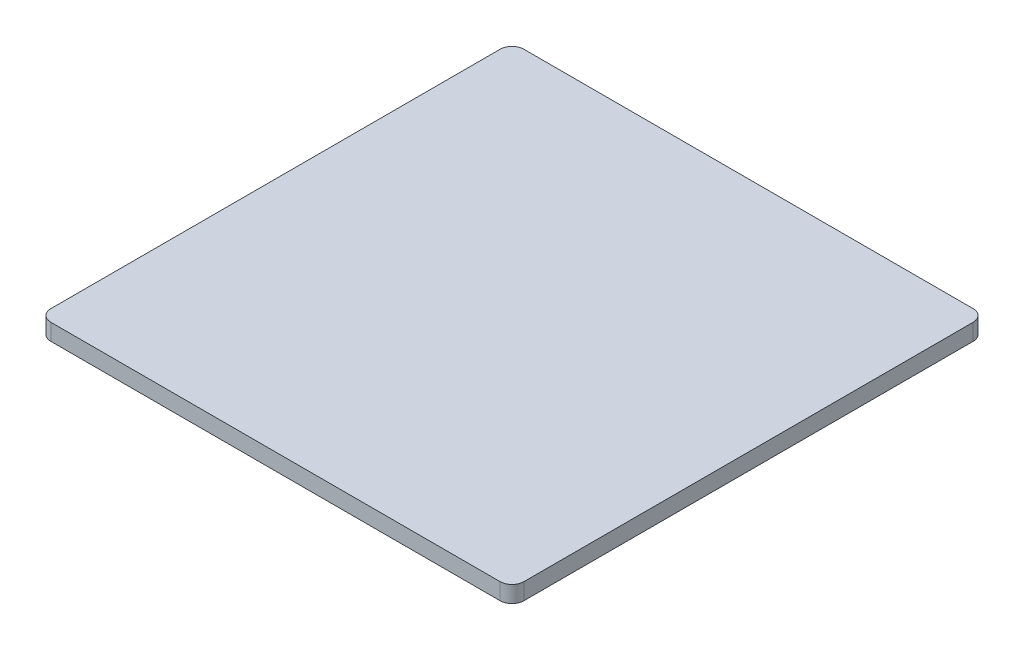
ISO-10303-21;
HEADER;
FILE_DESCRIPTION(('STEP AP214'),'2;1');
FILE_NAME('part.step','',(''),(''),'','','');
FILE_SCHEMA(('AUTOMOTIVE_DESIGN { 1 0 10303 214 1 1 1 1 }'));
ENDSEC;
DATA;
#1=APPLICATION_CONTEXT('core data for automotive mechanical design processes');
#2=APPLICATION_PROTOCOL_DEFINITION('international standard','automotive_design',2000,#1);
#3=PRODUCT_CONTEXT('',#1,'mechanical');
#4=PRODUCT('Part','Part','',(#3));
#5=PRODUCT_RELATED_PRODUCT_CATEGORY('part','',(#4));
#6=PRODUCT_DEFINITION_FORMATION('','',#4);
#7=PRODUCT_DEFINITION_CONTEXT('part definition',#1,'design');
#8=PRODUCT_DEFINITION('design','',#6,#7);
#9=PRODUCT_DEFINITION_SHAPE('','',#8);
#10=(LENGTH_UNIT() NAMED_UNIT(*) SI_UNIT(.MILLI.,.METRE.));
#11=(NAMED_UNIT(*) PLANE_ANGLE_UNIT() SI_UNIT($,.RADIAN.));
#12=(NAMED_UNIT(*) SI_UNIT($,.STERADIAN.) SOLID_ANGLE_UNIT());
#13=UNCERTAINTY_MEASURE_WITH_UNIT(LENGTH_MEASURE(1.E-05),#10,'distance_accuracy_value','');
#14=(GEOMETRIC_REPRESENTATION_CONTEXT(3) GLOBAL_UNCERTAINTY_ASSIGNED_CONTEXT((#13)) GLOBAL_UNIT_ASSIGNED_CONTEXT((#10,
#11,#12)) REPRESENTATION_CONTEXT('',''));
#15=CARTESIAN_POINT('',(0.,0.,0.));
#16=DIRECTION('',(0.,0.,1.));
#17=DIRECTION('',(1.,0.,0.));
#18=AXIS2_PLACEMENT_3D('',#15,#16,#17);
#19=CARTESIAN_POINT('',(9.5,0.7,-9.5));
#20=DIRECTION('',(0.,-1.,0.));
#21=DIRECTION('',(0.,0.,-1.));
#22=AXIS2_PLACEMENT_3D('',#19,#20,#21);
#23=CYLINDRICAL_SURFACE('',#22,0.5);
#24=CARTESIAN_POINT('',(9.5,0.,-9.5));
#25=DIRECTION('',(0.,1.,0.));
#26=DIRECTION('',(0.,0.,1.));
#27=AXIS2_PLACEMENT_3D('',#24,#25,#26);
#28=CIRCLE('',#27,0.5);
#29=CARTESIAN_POINT('',(10.,0.,-9.5));
#30=VERTEX_POINT('',#29);
#31=CARTESIAN_POINT('',(9.5,0.,-10.));
#32=VERTEX_POINT('',#31);
#33=EDGE_CURVE('E131',#30,#32,#28,.T.);
#34=ORIENTED_EDGE('',*,*,#33,.T.);
#35=DIRECTION('',(0.,-1.,0.));
#36=VECTOR('',#35,1.);
#37=CARTESIAN_POINT('',(9.5,0.7,-10.));
#38=LINE('',#37,#36);
#39=CARTESIAN_POINT('',(9.5,0.7,-10.));
#40=VERTEX_POINT('',#39);
#41=EDGE_CURVE('E11',#40,#32,#38,.T.);
#42=ORIENTED_EDGE('',*,*,#41,.F.);
#43=CARTESIAN_POINT('',(9.5,0.7,-9.5));
#44=DIRECTION('',(0.,1.,0.));
#45=DIRECTION('',(0.,0.,1.));
#46=AXIS2_PLACEMENT_3D('',#43,#44,#45);
#47=CIRCLE('',#46,0.5);
#48=CARTESIAN_POINT('',(10.,0.7,-9.5));
#49=VERTEX_POINT('',#48);
#50=EDGE_CURVE('E145',#49,#40,#47,.T.);
#51=ORIENTED_EDGE('',*,*,#50,.F.);
#52=DIRECTION('',(0.,-1.,0.));
#53=VECTOR('',#52,1.);
#54=CARTESIAN_POINT('',(10.,0.7,-9.5));
#55=LINE('',#54,#53);
#56=EDGE_CURVE('E127',#49,#30,#55,.T.);
#57=ORIENTED_EDGE('',*,*,#56,.T.);
#58=EDGE_LOOP('',(#34,#42,#51,#57));
#59=FACE_BOUND('',#58,.T.);
#60=ADVANCED_FACE('F35',(#59),#23,.T.);
#61=CARTESIAN_POINT('',(9.5,0.7,-10.));
#62=DIRECTION('',(0.,0.,1.));
#63=DIRECTION('',(1.,0.,0.));
#64=AXIS2_PLACEMENT_3D('',#61,#62,#63);
#65=PLANE('',#64);
#66=DIRECTION('',(-1.,0.,0.));
#67=VECTOR('',#66,1.);
#68=CARTESIAN_POINT('',(9.5,0.,-10.));
#69=LINE('',#68,#67);
#70=CARTESIAN_POINT('',(-9.5,0.,-10.));
#71=VERTEX_POINT('',#70);
#72=EDGE_CURVE('E134',#32,#71,#69,.T.);
#73=ORIENTED_EDGE('',*,*,#72,.T.);
#74=DIRECTION('',(0.,-1.,0.));
#75=VECTOR('',#74,1.);
#76=CARTESIAN_POINT('',(-9.5,0.7,-10.));
#77=LINE('',#76,#75);
#78=CARTESIAN_POINT('',(-9.5,0.7,-10.));
#79=VERTEX_POINT('',#78);
#80=EDGE_CURVE('E43',#79,#71,#77,.T.);
#81=ORIENTED_EDGE('',*,*,#80,.F.);
#82=DIRECTION('',(-1.,0.,0.));
#83=VECTOR('',#82,1.);
#84=CARTESIAN_POINT('',(9.5,0.7,-10.));
#85=LINE('',#84,#83);
#86=EDGE_CURVE('E94',#40,#79,#85,.T.);
#87=ORIENTED_EDGE('',*,*,#86,.F.);
#88=ORIENTED_EDGE('',*,*,#41,.T.);
#89=EDGE_LOOP('',(#73,#81,#87,#88));
#90=FACE_BOUND('',#89,.T.);
#91=ADVANCED_FACE('F180',(#90),#65,.F.);
#92=CARTESIAN_POINT('',(-9.5,0.7,-9.5));
#93=DIRECTION('',(0.,-1.,0.));
#94=DIRECTION('',(0.,0.,-1.));
#95=AXIS2_PLACEMENT_3D('',#92,#93,#94);
#96=CYLINDRICAL_SURFACE('',#95,0.5);
#97=CARTESIAN_POINT('',(-9.5,0.,-9.5));
#98=DIRECTION('',(0.,1.,0.));
#99=DIRECTION('',(0.,0.,1.));
#100=AXIS2_PLACEMENT_3D('',#97,#98,#99);
#101=CIRCLE('',#100,0.5);
#102=CARTESIAN_POINT('',(-10.,0.,-9.5));
#103=VERTEX_POINT('',#102);
#104=EDGE_CURVE('E136',#71,#103,#101,.T.);
#105=ORIENTED_EDGE('',*,*,#104,.T.);
#106=DIRECTION('',(0.,-1.,0.));
#107=VECTOR('',#106,1.);
#108=CARTESIAN_POINT('',(-10.,0.7,-9.5));
#109=LINE('',#108,#107);
#110=CARTESIAN_POINT('',(-10.,0.7,-9.5));
#111=VERTEX_POINT('',#110);
#112=EDGE_CURVE('E152',#111,#103,#109,.T.);
#113=ORIENTED_EDGE('',*,*,#112,.F.);
#114=CARTESIAN_POINT('',(-9.5,0.7,-9.5));
#115=DIRECTION('',(0.,1.,0.));
#116=DIRECTION('',(0.,0.,1.));
#117=AXIS2_PLACEMENT_3D('',#114,#115,#116);
#118=CIRCLE('',#117,0.5);
#119=EDGE_CURVE('E160',#79,#111,#118,.T.);
#120=ORIENTED_EDGE('',*,*,#119,.F.);
#121=ORIENTED_EDGE('',*,*,#80,.T.);
#122=EDGE_LOOP('',(#105,#113,#120,#121));
#123=FACE_BOUND('',#122,.T.);
#124=ADVANCED_FACE('F158',(#123),#96,.T.);
#125=CARTESIAN_POINT('',(-10.,0.7,9.5));
#126=DIRECTION('',(1.,0.,0.));
#127=DIRECTION('',(0.,0.,-1.));
#128=AXIS2_PLACEMENT_3D('',#125,#126,#127);
#129=PLANE('',#128);
#130=DIRECTION('',(0.,0.,1.));
#131=VECTOR('',#130,1.);
#132=CARTESIAN_POINT('',(-10.,0.,9.5));
#133=LINE('',#132,#131);
#134=CARTESIAN_POINT('',(-10.,0.,9.5));
#135=VERTEX_POINT('',#134);
#136=EDGE_CURVE('E138',#103,#135,#133,.T.);
#137=ORIENTED_EDGE('',*,*,#136,.T.);
#138=DIRECTION('',(0.,-1.,0.));
#139=VECTOR('',#138,1.);
#140=CARTESIAN_POINT('',(-10.,0.7,9.5));
#141=LINE('',#140,#139);
#142=CARTESIAN_POINT('',(-10.,0.7,9.5));
#143=VERTEX_POINT('',#142);
#144=EDGE_CURVE('E149',#143,#135,#141,.T.);
#145=ORIENTED_EDGE('',*,*,#144,.F.);
#146=DIRECTION('',(0.,0.,1.));
#147=VECTOR('',#146,1.);
#148=CARTESIAN_POINT('',(-10.,0.7,9.5));
#149=LINE('',#148,#147);
#150=EDGE_CURVE('E172',#111,#143,#149,.T.);
#151=ORIENTED_EDGE('',*,*,#150,.F.);
#152=ORIENTED_EDGE('',*,*,#112,.T.);
#153=EDGE_LOOP('',(#137,#145,#151,#152));
#154=FACE_BOUND('',#153,.T.);
#155=ADVANCED_FACE('F168',(#154),#129,.F.);
#156=CARTESIAN_POINT('',(-9.5,0.7,9.5));
#157=DIRECTION('',(0.,-1.,0.));
#158=DIRECTION('',(0.,0.,-1.));
#159=AXIS2_PLACEMENT_3D('',#156,#157,#158);
#160=CYLINDRICAL_SURFACE('',#159,0.5);
#161=CARTESIAN_POINT('',(-9.5,0.,9.5));
#162=DIRECTION('',(0.,1.,0.));
#163=DIRECTION('',(0.,0.,-1.));
#164=AXIS2_PLACEMENT_3D('',#161,#162,#163);
#165=CIRCLE('',#164,0.5);
#166=CARTESIAN_POINT('',(-9.5,0.,10.));
#167=VERTEX_POINT('',#166);
#168=EDGE_CURVE('E140',#135,#167,#165,.T.);
#169=ORIENTED_EDGE('',*,*,#168,.T.);
#170=DIRECTION('',(0.,-1.,0.));
#171=VECTOR('',#170,1.);
#172=CARTESIAN_POINT('',(-9.5,0.7,10.));
#173=LINE('',#172,#171);
#174=CARTESIAN_POINT('',(-9.5,0.7,10.));
#175=VERTEX_POINT('',#174);
#176=EDGE_CURVE('E122',#175,#167,#173,.T.);
#177=ORIENTED_EDGE('',*,*,#176,.F.);
#178=CARTESIAN_POINT('',(-9.5,0.7,9.5));
#179=DIRECTION('',(0.,1.,0.));
#180=DIRECTION('',(0.,0.,-1.));
#181=AXIS2_PLACEMENT_3D('',#178,#179,#180);
#182=CIRCLE('',#181,0.5);
#183=EDGE_CURVE('E113',#143,#175,#182,.T.);
#184=ORIENTED_EDGE('',*,*,#183,.F.);
#185=ORIENTED_EDGE('',*,*,#144,.T.);
#186=EDGE_LOOP('',(#169,#177,#184,#185));
#187=FACE_BOUND('',#186,.T.);
#188=ADVANCED_FACE('F171',(#187),#160,.T.);
#189=CARTESIAN_POINT('',(9.5,0.7,10.));
#190=DIRECTION('',(0.,0.,-1.));
#191=DIRECTION('',(-1.,0.,0.));
#192=AXIS2_PLACEMENT_3D('',#189,#190,#191);
#193=PLANE('',#192);
#194=DIRECTION('',(1.,0.,0.));
#195=VECTOR('',#194,1.);
#196=CARTESIAN_POINT('',(9.5,0.,10.));
#197=LINE('',#196,#195);
#198=CARTESIAN_POINT('',(9.5,0.,10.));
#199=VERTEX_POINT('',#198);
#200=EDGE_CURVE('E121',#167,#199,#197,.T.);
#201=ORIENTED_EDGE('',*,*,#200,.T.);
#202=DIRECTION('',(0.,-1.,0.));
#203=VECTOR('',#202,1.);
#204=CARTESIAN_POINT('',(9.5,0.7,10.));
#205=LINE('',#204,#203);
#206=CARTESIAN_POINT('',(9.5,0.7,10.));
#207=VERTEX_POINT('',#206);
#208=EDGE_CURVE('E118',#207,#199,#205,.T.);
#209=ORIENTED_EDGE('',*,*,#208,.F.);
#210=DIRECTION('',(1.,0.,0.));
#211=VECTOR('',#210,1.);
#212=CARTESIAN_POINT('',(9.5,0.7,10.));
#213=LINE('',#212,#211);
#214=EDGE_CURVE('E107',#175,#207,#213,.T.);
#215=ORIENTED_EDGE('',*,*,#214,.F.);
#216=ORIENTED_EDGE('',*,*,#176,.T.);
#217=EDGE_LOOP('',(#201,#209,#215,#216));
#218=FACE_BOUND('',#217,.T.);
#219=ADVANCED_FACE('F119',(#218),#193,.F.);
#220=CARTESIAN_POINT('',(9.5,0.7,9.5));
#221=DIRECTION('',(0.,-1.,0.));
#222=DIRECTION('',(0.,0.,-1.));
#223=AXIS2_PLACEMENT_3D('',#220,#221,#222);
#224=CYLINDRICAL_SURFACE('',#223,0.500000000000001);
#225=CARTESIAN_POINT('',(9.5,0.,9.5));
#226=DIRECTION('',(0.,1.,0.));
#227=DIRECTION('',(0.,0.,1.));
#228=AXIS2_PLACEMENT_3D('',#225,#226,#227);
#229=CIRCLE('',#228,0.500000000000001);
#230=CARTESIAN_POINT('',(10.,0.,9.5));
#231=VERTEX_POINT('',#230);
#232=EDGE_CURVE('E80',#199,#231,#229,.T.);
#233=ORIENTED_EDGE('',*,*,#232,.T.);
#234=DIRECTION('',(0.,-1.,0.));
#235=VECTOR('',#234,1.);
#236=CARTESIAN_POINT('',(10.,0.7,9.5));
#237=LINE('',#236,#235);
#238=CARTESIAN_POINT('',(10.,0.7,9.5));
#239=VERTEX_POINT('',#238);
#240=EDGE_CURVE('E123',#239,#231,#237,.T.);
#241=ORIENTED_EDGE('',*,*,#240,.F.);
#242=CARTESIAN_POINT('',(9.5,0.7,9.5));
#243=DIRECTION('',(0.,1.,0.));
#244=DIRECTION('',(0.,0.,1.));
#245=AXIS2_PLACEMENT_3D('',#242,#243,#244);
#246=CIRCLE('',#245,0.500000000000001);
#247=EDGE_CURVE('E111',#207,#239,#246,.T.);
#248=ORIENTED_EDGE('',*,*,#247,.F.);
#249=ORIENTED_EDGE('',*,*,#208,.T.);
#250=EDGE_LOOP('',(#233,#241,#248,#249));
#251=FACE_BOUND('',#250,.T.);
#252=ADVANCED_FACE('F125',(#251),#224,.T.);
#253=CARTESIAN_POINT('',(10.,0.7,9.5));
#254=DIRECTION('',(-1.,0.,0.));
#255=DIRECTION('',(0.,0.,1.));
#256=AXIS2_PLACEMENT_3D('',#253,#254,#255);
#257=PLANE('',#256);
#258=DIRECTION('',(0.,0.,-1.));
#259=VECTOR('',#258,1.);
#260=CARTESIAN_POINT('',(10.,0.,9.5));
#261=LINE('',#260,#259);
#262=EDGE_CURVE('E86',#231,#30,#261,.T.);
#263=ORIENTED_EDGE('',*,*,#262,.T.);
#264=ORIENTED_EDGE('',*,*,#56,.F.);
#265=DIRECTION('',(0.,0.,-1.));
#266=VECTOR('',#265,1.);
#267=CARTESIAN_POINT('',(10.,0.7,9.5));
#268=LINE('',#267,#266);
#269=EDGE_CURVE('E51',#239,#49,#268,.T.);
#270=ORIENTED_EDGE('',*,*,#269,.F.);
#271=ORIENTED_EDGE('',*,*,#240,.T.);
#272=EDGE_LOOP('',(#263,#264,#270,#271));
#273=FACE_BOUND('',#272,.T.);
#274=ADVANCED_FACE('F196',(#273),#257,.F.);
#275=CARTESIAN_POINT('',(9.5,0.7,-9.5));
#276=DIRECTION('',(0.,1.,0.));
#277=DIRECTION('',(0.,0.,1.));
#278=AXIS2_PLACEMENT_3D('',#275,#276,#277);
#279=PLANE('',#278);
#280=ORIENTED_EDGE('',*,*,#50,.T.);
#281=ORIENTED_EDGE('',*,*,#86,.T.);
#282=ORIENTED_EDGE('',*,*,#119,.T.);
#283=ORIENTED_EDGE('',*,*,#150,.T.);
#284=ORIENTED_EDGE('',*,*,#183,.T.);
#285=ORIENTED_EDGE('',*,*,#214,.T.);
#286=ORIENTED_EDGE('',*,*,#247,.T.);
#287=ORIENTED_EDGE('',*,*,#269,.T.);
#288=EDGE_LOOP('',(#280,#281,#282,#283,#284,#285,#286,#287));
#289=FACE_BOUND('',#288,.T.);
#290=ADVANCED_FACE('F109',(#289),#279,.T.);
#291=CARTESIAN_POINT('',(9.5,0.,-9.5));
#292=DIRECTION('',(0.,1.,0.));
#293=DIRECTION('',(0.,0.,1.));
#294=AXIS2_PLACEMENT_3D('',#291,#292,#293);
#295=PLANE('',#294);
#296=ORIENTED_EDGE('',*,*,#33,.F.);
#297=ORIENTED_EDGE('',*,*,#262,.F.);
#298=ORIENTED_EDGE('',*,*,#232,.F.);
#299=ORIENTED_EDGE('',*,*,#200,.F.);
#300=ORIENTED_EDGE('',*,*,#168,.F.);
#301=ORIENTED_EDGE('',*,*,#136,.F.);
#302=ORIENTED_EDGE('',*,*,#104,.F.);
#303=ORIENTED_EDGE('',*,*,#72,.F.);
#304=EDGE_LOOP('',(#296,#297,#298,#299,#300,#301,#302,#303));
#305=FACE_BOUND('',#304,.T.);
#306=ADVANCED_FACE('F164',(#305),#295,.F.);
#307=CLOSED_SHELL('',(#60,#91,#124,#155,#188,#219,#252,#274,#290,#306));
#308=MANIFOLD_SOLID_BREP('B2',#307);
#309=ADVANCED_BREP_SHAPE_REPRESENTATION('',(#18,#308),#14);
#310=SHAPE_DEFINITION_REPRESENTATION(#9,#309);
ENDSEC;
END-ISO-10303-21;
